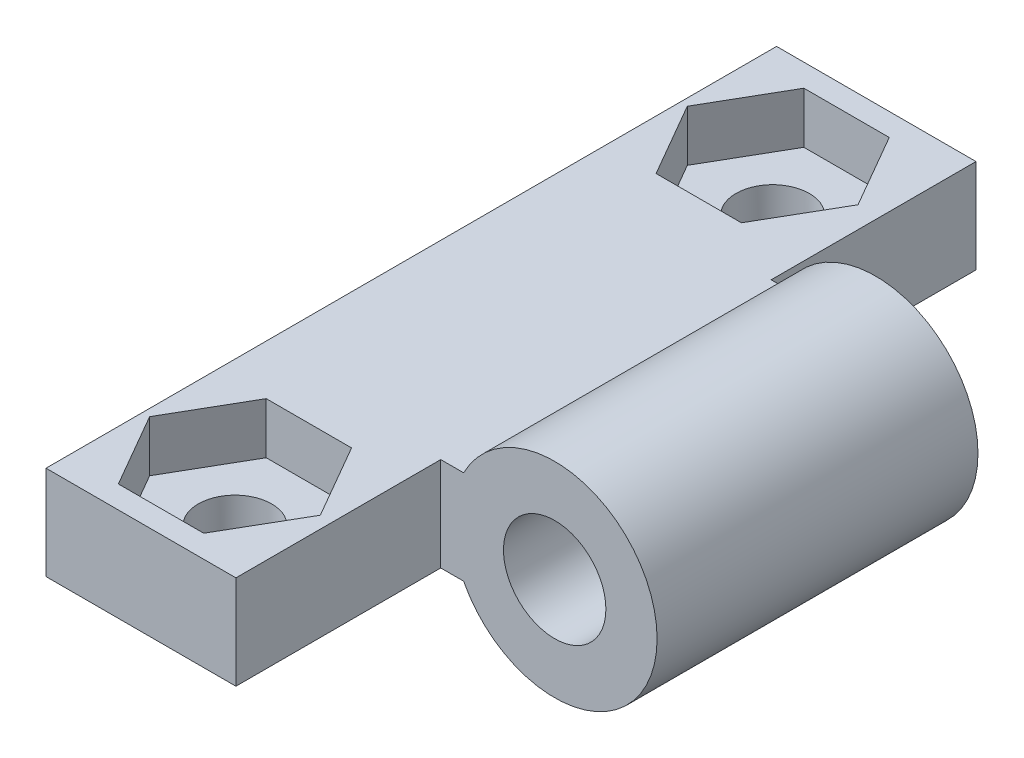
ISO-10303-21;
HEADER;
FILE_DESCRIPTION(('STEP AP214'),'2;1');
FILE_NAME('part.step','',(''),(''),'','','');
FILE_SCHEMA(('AUTOMOTIVE_DESIGN { 1 0 10303 214 1 1 1 1 }'));
ENDSEC;
DATA;
#1=APPLICATION_CONTEXT('core data for automotive mechanical design processes');
#2=APPLICATION_PROTOCOL_DEFINITION('international standard','automotive_design',2000,#1);
#3=PRODUCT_CONTEXT('',#1,'mechanical');
#4=PRODUCT('Part','Part','',(#3));
#5=PRODUCT_RELATED_PRODUCT_CATEGORY('part','',(#4));
#6=PRODUCT_DEFINITION_FORMATION('','',#4);
#7=PRODUCT_DEFINITION_CONTEXT('part definition',#1,'design');
#8=PRODUCT_DEFINITION('design','',#6,#7);
#9=PRODUCT_DEFINITION_SHAPE('','',#8);
#10=(LENGTH_UNIT() NAMED_UNIT(*) SI_UNIT(.MILLI.,.METRE.));
#11=(NAMED_UNIT(*) PLANE_ANGLE_UNIT() SI_UNIT($,.RADIAN.));
#12=(NAMED_UNIT(*) SI_UNIT($,.STERADIAN.) SOLID_ANGLE_UNIT());
#13=UNCERTAINTY_MEASURE_WITH_UNIT(LENGTH_MEASURE(1.E-05),#10,'distance_accuracy_value','');
#14=(GEOMETRIC_REPRESENTATION_CONTEXT(3) GLOBAL_UNCERTAINTY_ASSIGNED_CONTEXT((#13)) GLOBAL_UNIT_ASSIGNED_CONTEXT((#10,
#11,#12)) REPRESENTATION_CONTEXT('',''));
#15=CARTESIAN_POINT('',(0.,0.,0.));
#16=DIRECTION('',(0.,0.,1.));
#17=DIRECTION('',(1.,0.,0.));
#18=AXIS2_PLACEMENT_3D('',#15,#16,#17);
#19=CARTESIAN_POINT('',(0.,5.5,0.));
#20=DIRECTION('',(1.,0.,0.));
#21=DIRECTION('',(0.,0.,-1.));
#22=AXIS2_PLACEMENT_3D('',#19,#20,#21);
#23=PLANE('',#22);
#24=DIRECTION('',(0.,0.,1.));
#25=VECTOR('',#24,1.);
#26=CARTESIAN_POINT('',(0.,0.,0.));
#27=LINE('',#26,#25);
#28=CARTESIAN_POINT('',(0.,0.,0.));
#29=VERTEX_POINT('',#28);
#30=CARTESIAN_POINT('',(0.,0.,42.8));
#31=VERTEX_POINT('',#30);
#32=EDGE_CURVE('E374',#29,#31,#27,.T.);
#33=ORIENTED_EDGE('',*,*,#32,.T.);
#34=DIRECTION('',(0.,-1.,0.));
#35=VECTOR('',#34,1.);
#36=CARTESIAN_POINT('',(0.,5.5,42.8));
#37=LINE('',#36,#35);
#38=CARTESIAN_POINT('',(0.,5.5,42.8));
#39=VERTEX_POINT('',#38);
#40=EDGE_CURVE('E388',#39,#31,#37,.T.);
#41=ORIENTED_EDGE('',*,*,#40,.F.);
#42=DIRECTION('',(0.,0.,1.));
#43=VECTOR('',#42,1.);
#44=CARTESIAN_POINT('',(0.,5.5,0.));
#45=LINE('',#44,#43);
#46=CARTESIAN_POINT('',(0.,5.5,0.));
#47=VERTEX_POINT('',#46);
#48=EDGE_CURVE('E361',#47,#39,#45,.T.);
#49=ORIENTED_EDGE('',*,*,#48,.F.);
#50=DIRECTION('',(0.,-1.,0.));
#51=VECTOR('',#50,1.);
#52=CARTESIAN_POINT('',(0.,5.5,0.));
#53=LINE('',#52,#51);
#54=EDGE_CURVE('E373',#47,#29,#53,.T.);
#55=ORIENTED_EDGE('',*,*,#54,.T.);
#56=EDGE_LOOP('',(#33,#41,#49,#55));
#57=FACE_BOUND('',#56,.T.);
#58=ADVANCED_FACE('F38',(#57),#23,.F.);
#59=CARTESIAN_POINT('',(0.,5.5,42.8));
#60=DIRECTION('',(0.,0.,-1.));
#61=DIRECTION('',(-1.,0.,0.));
#62=AXIS2_PLACEMENT_3D('',#59,#60,#61);
#63=PLANE('',#62);
#64=DIRECTION('',(1.,0.,0.));
#65=VECTOR('',#64,1.);
#66=CARTESIAN_POINT('',(0.,0.,42.8));
#67=LINE('',#66,#65);
#68=CARTESIAN_POINT('',(11.1256258676462,0.,42.8));
#69=VERTEX_POINT('',#68);
#70=EDGE_CURVE('E378',#31,#69,#67,.T.);
#71=ORIENTED_EDGE('',*,*,#70,.T.);
#72=DIRECTION('',(0.,-1.,0.));
#73=VECTOR('',#72,1.);
#74=CARTESIAN_POINT('',(11.1256258676462,9.85688031732629,42.8));
#75=LINE('',#74,#73);
#76=CARTESIAN_POINT('',(11.1256258676462,5.5,42.8));
#77=VERTEX_POINT('',#76);
#78=EDGE_CURVE('E186',#77,#69,#75,.T.);
#79=ORIENTED_EDGE('',*,*,#78,.F.);
#80=DIRECTION('',(1.,0.,0.));
#81=VECTOR('',#80,1.);
#82=CARTESIAN_POINT('',(0.,5.5,42.8));
#83=LINE('',#82,#81);
#84=EDGE_CURVE('E365',#39,#77,#83,.T.);
#85=ORIENTED_EDGE('',*,*,#84,.F.);
#86=ORIENTED_EDGE('',*,*,#40,.T.);
#87=EDGE_LOOP('',(#71,#79,#85,#86));
#88=FACE_BOUND('',#87,.T.);
#89=ADVANCED_FACE('F419',(#88),#63,.F.);
#90=CARTESIAN_POINT('',(0.,5.5,0.));
#91=DIRECTION('',(0.,0.,1.));
#92=DIRECTION('',(1.,0.,0.));
#93=AXIS2_PLACEMENT_3D('',#90,#91,#92);
#94=PLANE('',#93);
#95=DIRECTION('',(-1.,0.,0.));
#96=VECTOR('',#95,1.);
#97=CARTESIAN_POINT('',(0.,5.5,0.));
#98=LINE('',#97,#96);
#99=CARTESIAN_POINT('',(11.6830282454759,5.5,0.));
#100=VERTEX_POINT('',#99);
#101=EDGE_CURVE('E370',#100,#47,#98,.T.);
#102=ORIENTED_EDGE('',*,*,#101,.F.);
#103=DIRECTION('',(0.,1.,0.));
#104=VECTOR('',#103,1.);
#105=CARTESIAN_POINT('',(11.6830282454759,11.3517321487782,0.));
#106=LINE('',#105,#104);
#107=CARTESIAN_POINT('',(11.6830282454759,0.,0.));
#108=VERTEX_POINT('',#107);
#109=EDGE_CURVE('E181',#108,#100,#106,.T.);
#110=ORIENTED_EDGE('',*,*,#109,.F.);
#111=DIRECTION('',(-1.,0.,0.));
#112=VECTOR('',#111,1.);
#113=CARTESIAN_POINT('',(0.,0.,0.));
#114=LINE('',#113,#112);
#115=EDGE_CURVE('E366',#108,#29,#114,.T.);
#116=ORIENTED_EDGE('',*,*,#115,.T.);
#117=ORIENTED_EDGE('',*,*,#54,.F.);
#118=EDGE_LOOP('',(#102,#110,#116,#117));
#119=FACE_BOUND('',#118,.T.);
#120=ADVANCED_FACE('F425',(#119),#94,.F.);
#121=CARTESIAN_POINT('',(0.,5.5,0.));
#122=DIRECTION('',(0.,1.,0.));
#123=DIRECTION('',(0.,0.,1.));
#124=AXIS2_PLACEMENT_3D('',#121,#122,#123);
#125=PLANE('',#124);
#126=DIRECTION('',(0.,0.,1.));
#127=VECTOR('',#126,1.);
#128=CARTESIAN_POINT('',(11.6830282454759,5.5,0.));
#129=LINE('',#128,#127);
#130=CARTESIAN_POINT('',(11.6830282454759,5.5,12.));
#131=VERTEX_POINT('',#130);
#132=EDGE_CURVE('E176',#100,#131,#129,.T.);
#133=ORIENTED_EDGE('',*,*,#132,.F.);
#134=ORIENTED_EDGE('',*,*,#101,.T.);
#135=ORIENTED_EDGE('',*,*,#48,.T.);
#136=ORIENTED_EDGE('',*,*,#84,.T.);
#137=DIRECTION('',(0.,0.,1.));
#138=VECTOR('',#137,1.);
#139=CARTESIAN_POINT('',(11.1256258676462,5.5,0.));
#140=LINE('',#139,#138);
#141=CARTESIAN_POINT('',(11.1256258676462,5.5,30.8));
#142=VERTEX_POINT('',#141);
#143=EDGE_CURVE('E217',#142,#77,#140,.T.);
#144=ORIENTED_EDGE('',*,*,#143,.F.);
#145=DIRECTION('',(1.,0.,0.));
#146=VECTOR('',#145,1.);
#147=CARTESIAN_POINT('',(0.,5.5,30.8));
#148=LINE('',#147,#146);
#149=CARTESIAN_POINT('',(12.4673177480746,5.5,30.8));
#150=VERTEX_POINT('',#149);
#151=EDGE_CURVE('E214',#142,#150,#148,.T.);
#152=ORIENTED_EDGE('',*,*,#151,.T.);
#153=DIRECTION('',(0.,0.,1.));
#154=VECTOR('',#153,1.);
#155=CARTESIAN_POINT('',(12.4673177480746,5.5,-4.97056274847715));
#156=LINE('',#155,#154);
#157=CARTESIAN_POINT('',(12.4673177480746,5.5,12.));
#158=VERTEX_POINT('',#157);
#159=EDGE_CURVE('E201',#158,#150,#156,.T.);
#160=ORIENTED_EDGE('',*,*,#159,.F.);
#161=DIRECTION('',(-1.,0.,0.));
#162=VECTOR('',#161,1.);
#163=CARTESIAN_POINT('',(0.,5.5,12.));
#164=LINE('',#163,#162);
#165=EDGE_CURVE('E187',#158,#131,#164,.T.);
#166=ORIENTED_EDGE('',*,*,#165,.T.);
#167=EDGE_LOOP('',(#133,#134,#135,#136,#144,#152,#160,#166));
#168=FACE_BOUND('',#167,.T.);
#169=DIRECTION('',(-0.5,0.,0.866025403784439));
#170=VECTOR('',#169,1.);
#171=CARTESIAN_POINT('',(0.420411498092338,5.5,5.65));
#172=LINE('',#171,#170);
#173=CARTESIAN_POINT('',(2.92041149809234,5.5,1.31987298107781));
#174=VERTEX_POINT('',#173);
#175=CARTESIAN_POINT('',(0.420411498092339,5.5,5.65));
#176=VERTEX_POINT('',#175);
#177=EDGE_CURVE('E61',#174,#176,#172,.T.);
#178=ORIENTED_EDGE('',*,*,#177,.F.);
#179=DIRECTION('',(-1.,0.,0.));
#180=VECTOR('',#179,1.);
#181=CARTESIAN_POINT('',(2.92041149809234,5.5,1.31987298107781));
#182=LINE('',#181,#180);
#183=CARTESIAN_POINT('',(7.92041149809234,5.5,1.31987298107781));
#184=VERTEX_POINT('',#183);
#185=EDGE_CURVE('E236',#184,#174,#182,.T.);
#186=ORIENTED_EDGE('',*,*,#185,.F.);
#187=DIRECTION('',(-0.5,0.,-0.866025403784439));
#188=VECTOR('',#187,1.);
#189=CARTESIAN_POINT('',(7.92041149809234,5.5,1.31987298107781));
#190=LINE('',#189,#188);
#191=CARTESIAN_POINT('',(10.4204114980923,5.5,5.65));
#192=VERTEX_POINT('',#191);
#193=EDGE_CURVE('E272',#192,#184,#190,.T.);
#194=ORIENTED_EDGE('',*,*,#193,.F.);
#195=DIRECTION('',(0.5,0.,-0.866025403784438));
#196=VECTOR('',#195,1.);
#197=CARTESIAN_POINT('',(10.4204114980923,5.5,5.65));
#198=LINE('',#197,#196);
#199=CARTESIAN_POINT('',(7.92041149809234,5.5,9.98012701892219));
#200=VERTEX_POINT('',#199);
#201=EDGE_CURVE('E268',#200,#192,#198,.T.);
#202=ORIENTED_EDGE('',*,*,#201,.F.);
#203=DIRECTION('',(1.,0.,0.));
#204=VECTOR('',#203,1.);
#205=CARTESIAN_POINT('',(7.92041149809234,5.5,9.98012701892219));
#206=LINE('',#205,#204);
#207=CARTESIAN_POINT('',(2.92041149809234,5.5,9.98012701892219));
#208=VERTEX_POINT('',#207);
#209=EDGE_CURVE('E264',#208,#200,#206,.T.);
#210=ORIENTED_EDGE('',*,*,#209,.F.);
#211=DIRECTION('',(0.5,0.,0.866025403784438));
#212=VECTOR('',#211,1.);
#213=CARTESIAN_POINT('',(2.92041149809234,5.5,9.98012701892219));
#214=LINE('',#213,#212);
#215=EDGE_CURVE('E259',#176,#208,#214,.T.);
#216=ORIENTED_EDGE('',*,*,#215,.F.);
#217=EDGE_LOOP('',(#178,#186,#194,#202,#210,#216));
#218=FACE_BOUND('',#217,.T.);
#219=DIRECTION('',(-1.,0.,0.));
#220=VECTOR('',#219,1.);
#221=CARTESIAN_POINT('',(2.92041149809234,5.5,32.8198729810778));
#222=LINE('',#221,#220);
#223=CARTESIAN_POINT('',(7.92041149809234,5.5,32.8198729810778));
#224=VERTEX_POINT('',#223);
#225=CARTESIAN_POINT('',(2.92041149809234,5.5,32.8198729810778));
#226=VERTEX_POINT('',#225);
#227=EDGE_CURVE('E230',#224,#226,#222,.T.);
#228=ORIENTED_EDGE('',*,*,#227,.F.);
#229=DIRECTION('',(-0.5,0.,-0.866025403784438));
#230=VECTOR('',#229,1.);
#231=CARTESIAN_POINT('',(7.92041149809234,5.5,32.8198729810778));
#232=LINE('',#231,#230);
#233=CARTESIAN_POINT('',(10.4204114980923,5.5,37.15));
#234=VERTEX_POINT('',#233);
#235=EDGE_CURVE('E302',#234,#224,#232,.T.);
#236=ORIENTED_EDGE('',*,*,#235,.F.);
#237=DIRECTION('',(0.5,0.,-0.866025403784439));
#238=VECTOR('',#237,1.);
#239=CARTESIAN_POINT('',(10.4204114980923,5.5,37.15));
#240=LINE('',#239,#238);
#241=CARTESIAN_POINT('',(7.92041149809234,5.5,41.4801270189222));
#242=VERTEX_POINT('',#241);
#243=EDGE_CURVE('E337',#242,#234,#240,.T.);
#244=ORIENTED_EDGE('',*,*,#243,.F.);
#245=DIRECTION('',(1.,0.,0.));
#246=VECTOR('',#245,1.);
#247=CARTESIAN_POINT('',(7.92041149809234,5.5,41.4801270189222));
#248=LINE('',#247,#246);
#249=CARTESIAN_POINT('',(2.92041149809234,5.5,41.4801270189222));
#250=VERTEX_POINT('',#249);
#251=EDGE_CURVE('E333',#250,#242,#248,.T.);
#252=ORIENTED_EDGE('',*,*,#251,.F.);
#253=DIRECTION('',(0.5,0.,0.866025403784439));
#254=VECTOR('',#253,1.);
#255=CARTESIAN_POINT('',(2.92041149809234,5.5,41.4801270189222));
#256=LINE('',#255,#254);
#257=CARTESIAN_POINT('',(0.420411498092338,5.5,37.15));
#258=VERTEX_POINT('',#257);
#259=EDGE_CURVE('E329',#258,#250,#256,.T.);
#260=ORIENTED_EDGE('',*,*,#259,.F.);
#261=DIRECTION('',(-0.500000000000001,0.,0.866025403784438));
#262=VECTOR('',#261,1.);
#263=CARTESIAN_POINT('',(0.420411498092338,5.5,37.15));
#264=LINE('',#263,#262);
#265=EDGE_CURVE('E325',#226,#258,#264,.T.);
#266=ORIENTED_EDGE('',*,*,#265,.F.);
#267=EDGE_LOOP('',(#228,#236,#244,#252,#260,#266));
#268=FACE_BOUND('',#267,.T.);
#269=ADVANCED_FACE('F197',(#168,#218,#268),#125,.T.);
#270=CARTESIAN_POINT('',(0.,0.,0.));
#271=DIRECTION('',(0.,1.,0.));
#272=DIRECTION('',(0.,0.,1.));
#273=AXIS2_PLACEMENT_3D('',#270,#271,#272);
#274=PLANE('',#273);
#275=ORIENTED_EDGE('',*,*,#115,.F.);
#276=DIRECTION('',(0.,0.,1.));
#277=VECTOR('',#276,1.);
#278=CARTESIAN_POINT('',(11.6830282454759,0.,0.));
#279=LINE('',#278,#277);
#280=CARTESIAN_POINT('',(11.6830282454759,0.,12.));
#281=VERTEX_POINT('',#280);
#282=EDGE_CURVE('E11',#108,#281,#279,.T.);
#283=ORIENTED_EDGE('',*,*,#282,.T.);
#284=DIRECTION('',(-1.,0.,0.));
#285=VECTOR('',#284,1.);
#286=CARTESIAN_POINT('',(0.,0.,12.));
#287=LINE('',#286,#285);
#288=CARTESIAN_POINT('',(12.4673177480746,0.,12.));
#289=VERTEX_POINT('',#288);
#290=EDGE_CURVE('E194',#289,#281,#287,.T.);
#291=ORIENTED_EDGE('',*,*,#290,.F.);
#292=DIRECTION('',(0.,0.,1.));
#293=VECTOR('',#292,1.);
#294=CARTESIAN_POINT('',(12.4673177480746,0.,-4.97056274847715));
#295=LINE('',#294,#293);
#296=CARTESIAN_POINT('',(12.4673177480746,0.,30.8));
#297=VERTEX_POINT('',#296);
#298=EDGE_CURVE('E392',#289,#297,#295,.T.);
#299=ORIENTED_EDGE('',*,*,#298,.T.);
#300=DIRECTION('',(1.,0.,0.));
#301=VECTOR('',#300,1.);
#302=CARTESIAN_POINT('',(0.,0.,30.8));
#303=LINE('',#302,#301);
#304=CARTESIAN_POINT('',(11.1256258676462,0.,30.8));
#305=VERTEX_POINT('',#304);
#306=EDGE_CURVE('E53',#305,#297,#303,.T.);
#307=ORIENTED_EDGE('',*,*,#306,.F.);
#308=DIRECTION('',(0.,0.,1.));
#309=VECTOR('',#308,1.);
#310=CARTESIAN_POINT('',(11.1256258676462,0.,0.));
#311=LINE('',#310,#309);
#312=EDGE_CURVE('E46',#305,#69,#311,.T.);
#313=ORIENTED_EDGE('',*,*,#312,.T.);
#314=ORIENTED_EDGE('',*,*,#70,.F.);
#315=ORIENTED_EDGE('',*,*,#32,.F.);
#316=EDGE_LOOP('',(#275,#283,#291,#299,#307,#313,#314,#315));
#317=FACE_BOUND('',#316,.T.);
#318=CARTESIAN_POINT('',(5.42041149809234,0.,5.65));
#319=DIRECTION('',(0.,1.,0.));
#320=DIRECTION('',(0.,0.,1.));
#321=AXIS2_PLACEMENT_3D('',#318,#319,#320);
#322=CIRCLE('',#321,2.15);
#323=CARTESIAN_POINT('',(5.42041149809234,0.,7.8));
#324=VERTEX_POINT('',#323);
#325=EDGE_CURVE('E379',#324,#324,#322,.T.);
#326=ORIENTED_EDGE('',*,*,#325,.T.);
#327=EDGE_LOOP('',(#326));
#328=FACE_BOUND('',#327,.T.);
#329=CARTESIAN_POINT('',(5.42041149809234,0.,37.15));
#330=DIRECTION('',(0.,1.,0.));
#331=DIRECTION('',(0.,0.,1.));
#332=AXIS2_PLACEMENT_3D('',#329,#330,#331);
#333=CIRCLE('',#332,2.15);
#334=CARTESIAN_POINT('',(5.42041149809234,0.,39.3));
#335=VERTEX_POINT('',#334);
#336=EDGE_CURVE('E393',#335,#335,#333,.T.);
#337=ORIENTED_EDGE('',*,*,#336,.T.);
#338=EDGE_LOOP('',(#337));
#339=FACE_BOUND('',#338,.T.);
#340=ADVANCED_FACE('F413',(#317,#328,#339),#274,.F.);
#341=CARTESIAN_POINT('',(5.42041149809234,-4.50000000000003,37.15));
#342=DIRECTION('',(0.,1.,0.));
#343=DIRECTION('',(0.,0.,1.));
#344=AXIS2_PLACEMENT_3D('',#341,#342,#343);
#345=CYLINDRICAL_SURFACE('',#344,2.15);
#346=CARTESIAN_POINT('',(5.42041149809234,2.49999999999997,37.15));
#347=DIRECTION('',(0.,-1.,0.));
#348=DIRECTION('',(0.,0.,-1.));
#349=AXIS2_PLACEMENT_3D('',#346,#347,#348);
#350=CIRCLE('',#349,2.15);
#351=CARTESIAN_POINT('',(5.42041149809234,2.49999999999997,35.));
#352=VERTEX_POINT('',#351);
#353=EDGE_CURVE('E397',#352,#352,#350,.F.);
#354=ORIENTED_EDGE('',*,*,#353,.T.);
#355=EDGE_LOOP('',(#354));
#356=FACE_BOUND('',#355,.T.);
#357=ORIENTED_EDGE('',*,*,#336,.F.);
#358=EDGE_LOOP('',(#357));
#359=FACE_BOUND('',#358,.T.);
#360=ADVANCED_FACE('F468',(#356,#359),#345,.F.);
#361=CARTESIAN_POINT('',(5.42041149809234,-4.50000000000003,5.65));
#362=DIRECTION('',(0.,1.,0.));
#363=DIRECTION('',(0.,0.,1.));
#364=AXIS2_PLACEMENT_3D('',#361,#362,#363);
#365=CYLINDRICAL_SURFACE('',#364,2.15);
#366=CARTESIAN_POINT('',(5.42041149809234,2.49999999999997,5.65));
#367=DIRECTION('',(0.,-1.,0.));
#368=DIRECTION('',(0.,0.,-1.));
#369=AXIS2_PLACEMENT_3D('',#366,#367,#368);
#370=CIRCLE('',#369,2.15);
#371=CARTESIAN_POINT('',(5.42041149809234,2.49999999999997,3.5));
#372=VERTEX_POINT('',#371);
#373=EDGE_CURVE('E282',#372,#372,#370,.F.);
#374=ORIENTED_EDGE('',*,*,#373,.T.);
#375=EDGE_LOOP('',(#374));
#376=FACE_BOUND('',#375,.T.);
#377=ORIENTED_EDGE('',*,*,#325,.F.);
#378=EDGE_LOOP('',(#377));
#379=FACE_BOUND('',#378,.T.);
#380=ADVANCED_FACE('F473',(#376,#379),#365,.F.);
#381=CARTESIAN_POINT('',(0.,2.49999999999997,0.));
#382=DIRECTION('',(0.,-1.,0.));
#383=DIRECTION('',(0.,0.,-1.));
#384=AXIS2_PLACEMENT_3D('',#381,#382,#383);
#385=PLANE('',#384);
#386=DIRECTION('',(-0.5,0.,0.866025403784439));
#387=VECTOR('',#386,1.);
#388=CARTESIAN_POINT('',(0.420411498092338,2.49999999999997,5.65));
#389=LINE('',#388,#387);
#390=CARTESIAN_POINT('',(2.92041149809234,2.49999999999997,1.31987298107781));
#391=VERTEX_POINT('',#390);
#392=CARTESIAN_POINT('',(0.420411498092338,2.49999999999997,5.65));
#393=VERTEX_POINT('',#392);
#394=EDGE_CURVE('E231',#391,#393,#389,.T.);
#395=ORIENTED_EDGE('',*,*,#394,.T.);
#396=DIRECTION('',(0.5,0.,0.866025403784438));
#397=VECTOR('',#396,1.);
#398=CARTESIAN_POINT('',(2.92041149809234,2.49999999999997,9.98012701892219));
#399=LINE('',#398,#397);
#400=CARTESIAN_POINT('',(2.92041149809234,2.49999999999997,9.98012701892219));
#401=VERTEX_POINT('',#400);
#402=EDGE_CURVE('E235',#393,#401,#399,.T.);
#403=ORIENTED_EDGE('',*,*,#402,.T.);
#404=DIRECTION('',(1.,0.,0.));
#405=VECTOR('',#404,1.);
#406=CARTESIAN_POINT('',(7.92041149809234,2.49999999999997,9.98012701892219));
#407=LINE('',#406,#405);
#408=CARTESIAN_POINT('',(7.92041149809234,2.49999999999997,9.98012701892219));
#409=VERTEX_POINT('',#408);
#410=EDGE_CURVE('E240',#401,#409,#407,.T.);
#411=ORIENTED_EDGE('',*,*,#410,.T.);
#412=DIRECTION('',(0.5,0.,-0.866025403784438));
#413=VECTOR('',#412,1.);
#414=CARTESIAN_POINT('',(10.4204114980923,2.49999999999997,5.65));
#415=LINE('',#414,#413);
#416=CARTESIAN_POINT('',(10.4204114980923,2.49999999999997,5.65));
#417=VERTEX_POINT('',#416);
#418=EDGE_CURVE('E244',#409,#417,#415,.T.);
#419=ORIENTED_EDGE('',*,*,#418,.T.);
#420=DIRECTION('',(-0.5,0.,-0.866025403784439));
#421=VECTOR('',#420,1.);
#422=CARTESIAN_POINT('',(7.92041149809234,2.49999999999997,1.31987298107781));
#423=LINE('',#422,#421);
#424=CARTESIAN_POINT('',(7.92041149809234,2.49999999999997,1.31987298107781));
#425=VERTEX_POINT('',#424);
#426=EDGE_CURVE('E248',#417,#425,#423,.T.);
#427=ORIENTED_EDGE('',*,*,#426,.T.);
#428=DIRECTION('',(-1.,0.,0.));
#429=VECTOR('',#428,1.);
#430=CARTESIAN_POINT('',(2.92041149809234,2.49999999999997,1.31987298107781));
#431=LINE('',#430,#429);
#432=EDGE_CURVE('E252',#425,#391,#431,.T.);
#433=ORIENTED_EDGE('',*,*,#432,.T.);
#434=EDGE_LOOP('',(#395,#403,#411,#419,#427,#433));
#435=FACE_BOUND('',#434,.T.);
#436=ORIENTED_EDGE('',*,*,#373,.F.);
#437=EDGE_LOOP('',(#436));
#438=FACE_BOUND('',#437,.T.);
#439=ADVANCED_FACE('F477',(#435,#438),#385,.F.);
#440=CARTESIAN_POINT('',(0.420411498092338,2.49999999999997,5.65));
#441=DIRECTION('',(-0.866025403784439,0.,-0.5));
#442=DIRECTION('',(-0.5,0.,0.866025403784439));
#443=AXIS2_PLACEMENT_3D('',#440,#441,#442);
#444=PLANE('',#443);
#445=ORIENTED_EDGE('',*,*,#177,.T.);
#446=DIRECTION('',(0.,1.,0.));
#447=VECTOR('',#446,1.);
#448=CARTESIAN_POINT('',(0.420411498092338,2.49999999999997,5.65));
#449=LINE('',#448,#447);
#450=EDGE_CURVE('E256',#393,#176,#449,.T.);
#451=ORIENTED_EDGE('',*,*,#450,.F.);
#452=ORIENTED_EDGE('',*,*,#394,.F.);
#453=DIRECTION('',(0.,1.,0.));
#454=VECTOR('',#453,1.);
#455=CARTESIAN_POINT('',(2.92041149809234,2.49999999999997,1.31987298107781));
#456=LINE('',#455,#454);
#457=EDGE_CURVE('E279',#391,#174,#456,.T.);
#458=ORIENTED_EDGE('',*,*,#457,.T.);
#459=EDGE_LOOP('',(#445,#451,#452,#458));
#460=FACE_BOUND('',#459,.T.);
#461=ADVANCED_FACE('F508',(#460),#444,.F.);
#462=CARTESIAN_POINT('',(2.92041149809234,2.49999999999997,1.31987298107781));
#463=DIRECTION('',(0.,0.,-1.));
#464=DIRECTION('',(-1.,0.,0.));
#465=AXIS2_PLACEMENT_3D('',#462,#463,#464);
#466=PLANE('',#465);
#467=ORIENTED_EDGE('',*,*,#185,.T.);
#468=ORIENTED_EDGE('',*,*,#457,.F.);
#469=ORIENTED_EDGE('',*,*,#432,.F.);
#470=DIRECTION('',(0.,1.,0.));
#471=VECTOR('',#470,1.);
#472=CARTESIAN_POINT('',(7.92041149809234,2.49999999999997,1.31987298107781));
#473=LINE('',#472,#471);
#474=EDGE_CURVE('E283',#425,#184,#473,.T.);
#475=ORIENTED_EDGE('',*,*,#474,.T.);
#476=EDGE_LOOP('',(#467,#468,#469,#475));
#477=FACE_BOUND('',#476,.T.);
#478=ADVANCED_FACE('F511',(#477),#466,.F.);
#479=CARTESIAN_POINT('',(7.92041149809234,2.49999999999997,1.31987298107781));
#480=DIRECTION('',(0.866025403784439,0.,-0.5));
#481=DIRECTION('',(-0.5,0.,-0.866025403784439));
#482=AXIS2_PLACEMENT_3D('',#479,#480,#481);
#483=PLANE('',#482);
#484=ORIENTED_EDGE('',*,*,#193,.T.);
#485=ORIENTED_EDGE('',*,*,#474,.F.);
#486=ORIENTED_EDGE('',*,*,#426,.F.);
#487=DIRECTION('',(0.,1.,0.));
#488=VECTOR('',#487,1.);
#489=CARTESIAN_POINT('',(10.4204114980923,2.49999999999997,5.65));
#490=LINE('',#489,#488);
#491=EDGE_CURVE('E286',#417,#192,#490,.T.);
#492=ORIENTED_EDGE('',*,*,#491,.T.);
#493=EDGE_LOOP('',(#484,#485,#486,#492));
#494=FACE_BOUND('',#493,.T.);
#495=ADVANCED_FACE('F522',(#494),#483,.F.);
#496=CARTESIAN_POINT('',(10.4204114980923,2.49999999999997,5.65));
#497=DIRECTION('',(0.866025403784439,0.,0.5));
#498=DIRECTION('',(0.5,0.,-0.866025403784439));
#499=AXIS2_PLACEMENT_3D('',#496,#497,#498);
#500=PLANE('',#499);
#501=ORIENTED_EDGE('',*,*,#201,.T.);
#502=ORIENTED_EDGE('',*,*,#491,.F.);
#503=ORIENTED_EDGE('',*,*,#418,.F.);
#504=DIRECTION('',(0.,1.,0.));
#505=VECTOR('',#504,1.);
#506=CARTESIAN_POINT('',(7.92041149809234,2.49999999999997,9.98012701892219));
#507=LINE('',#506,#505);
#508=EDGE_CURVE('E289',#409,#200,#507,.T.);
#509=ORIENTED_EDGE('',*,*,#508,.T.);
#510=EDGE_LOOP('',(#501,#502,#503,#509));
#511=FACE_BOUND('',#510,.T.);
#512=ADVANCED_FACE('F518',(#511),#500,.F.);
#513=CARTESIAN_POINT('',(7.92041149809234,2.49999999999997,9.98012701892219));
#514=DIRECTION('',(0.,0.,1.));
#515=DIRECTION('',(1.,0.,0.));
#516=AXIS2_PLACEMENT_3D('',#513,#514,#515);
#517=PLANE('',#516);
#518=ORIENTED_EDGE('',*,*,#209,.T.);
#519=ORIENTED_EDGE('',*,*,#508,.F.);
#520=ORIENTED_EDGE('',*,*,#410,.F.);
#521=DIRECTION('',(0.,1.,0.));
#522=VECTOR('',#521,1.);
#523=CARTESIAN_POINT('',(2.92041149809234,2.49999999999997,9.98012701892219));
#524=LINE('',#523,#522);
#525=EDGE_CURVE('E292',#401,#208,#524,.T.);
#526=ORIENTED_EDGE('',*,*,#525,.T.);
#527=EDGE_LOOP('',(#518,#519,#520,#526));
#528=FACE_BOUND('',#527,.T.);
#529=ADVANCED_FACE('F514',(#528),#517,.F.);
#530=CARTESIAN_POINT('',(2.92041149809234,2.49999999999997,9.98012701892219));
#531=DIRECTION('',(-0.866025403784438,0.,0.5));
#532=DIRECTION('',(0.5,0.,0.866025403784438));
#533=AXIS2_PLACEMENT_3D('',#530,#531,#532);
#534=PLANE('',#533);
#535=ORIENTED_EDGE('',*,*,#215,.T.);
#536=ORIENTED_EDGE('',*,*,#525,.F.);
#537=ORIENTED_EDGE('',*,*,#402,.F.);
#538=ORIENTED_EDGE('',*,*,#450,.T.);
#539=EDGE_LOOP('',(#535,#536,#537,#538));
#540=FACE_BOUND('',#539,.T.);
#541=ADVANCED_FACE('F506',(#540),#534,.F.);
#542=CARTESIAN_POINT('',(0.,2.49999999999997,0.));
#543=DIRECTION('',(0.,-1.,0.));
#544=DIRECTION('',(0.,0.,-1.));
#545=AXIS2_PLACEMENT_3D('',#542,#543,#544);
#546=PLANE('',#545);
#547=DIRECTION('',(-1.,0.,0.));
#548=VECTOR('',#547,1.);
#549=CARTESIAN_POINT('',(2.92041149809234,2.49999999999997,32.8198729810778));
#550=LINE('',#549,#548);
#551=CARTESIAN_POINT('',(7.92041149809234,2.49999999999997,32.8198729810778));
#552=VERTEX_POINT('',#551);
#553=CARTESIAN_POINT('',(2.92041149809234,2.49999999999997,32.8198729810778));
#554=VERTEX_POINT('',#553);
#555=EDGE_CURVE('E297',#552,#554,#550,.T.);
#556=ORIENTED_EDGE('',*,*,#555,.T.);
#557=DIRECTION('',(-0.500000000000001,0.,0.866025403784438));
#558=VECTOR('',#557,1.);
#559=CARTESIAN_POINT('',(0.420411498092338,2.49999999999997,37.15));
#560=LINE('',#559,#558);
#561=CARTESIAN_POINT('',(0.420411498092338,2.49999999999997,37.15));
#562=VERTEX_POINT('',#561);
#563=EDGE_CURVE('E301',#554,#562,#560,.T.);
#564=ORIENTED_EDGE('',*,*,#563,.T.);
#565=DIRECTION('',(0.5,0.,0.866025403784439));
#566=VECTOR('',#565,1.);
#567=CARTESIAN_POINT('',(2.92041149809234,2.49999999999997,41.4801270189222));
#568=LINE('',#567,#566);
#569=CARTESIAN_POINT('',(2.92041149809234,2.49999999999997,41.4801270189222));
#570=VERTEX_POINT('',#569);
#571=EDGE_CURVE('E306',#562,#570,#568,.T.);
#572=ORIENTED_EDGE('',*,*,#571,.T.);
#573=DIRECTION('',(1.,0.,0.));
#574=VECTOR('',#573,1.);
#575=CARTESIAN_POINT('',(7.92041149809234,2.49999999999997,41.4801270189222));
#576=LINE('',#575,#574);
#577=CARTESIAN_POINT('',(7.92041149809234,2.49999999999997,41.4801270189222));
#578=VERTEX_POINT('',#577);
#579=EDGE_CURVE('E310',#570,#578,#576,.T.);
#580=ORIENTED_EDGE('',*,*,#579,.T.);
#581=DIRECTION('',(0.5,0.,-0.866025403784439));
#582=VECTOR('',#581,1.);
#583=CARTESIAN_POINT('',(10.4204114980923,2.49999999999997,37.15));
#584=LINE('',#583,#582);
#585=CARTESIAN_POINT('',(10.4204114980923,2.49999999999997,37.15));
#586=VERTEX_POINT('',#585);
#587=EDGE_CURVE('E314',#578,#586,#584,.T.);
#588=ORIENTED_EDGE('',*,*,#587,.T.);
#589=DIRECTION('',(-0.5,0.,-0.866025403784438));
#590=VECTOR('',#589,1.);
#591=CARTESIAN_POINT('',(7.92041149809234,2.49999999999997,32.8198729810778));
#592=LINE('',#591,#590);
#593=EDGE_CURVE('E318',#586,#552,#592,.T.);
#594=ORIENTED_EDGE('',*,*,#593,.T.);
#595=EDGE_LOOP('',(#556,#564,#572,#580,#588,#594));
#596=FACE_BOUND('',#595,.T.);
#597=ORIENTED_EDGE('',*,*,#353,.F.);
#598=EDGE_LOOP('',(#597));
#599=FACE_BOUND('',#598,.T.);
#600=ADVANCED_FACE('F483',(#596,#599),#546,.F.);
#601=CARTESIAN_POINT('',(2.92041149809234,2.49999999999997,32.8198729810778));
#602=DIRECTION('',(0.,0.,-1.));
#603=DIRECTION('',(-1.,0.,0.));
#604=AXIS2_PLACEMENT_3D('',#601,#602,#603);
#605=PLANE('',#604);
#606=ORIENTED_EDGE('',*,*,#227,.T.);
#607=DIRECTION('',(0.,1.,0.));
#608=VECTOR('',#607,1.);
#609=CARTESIAN_POINT('',(2.92041149809234,2.49999999999997,32.8198729810778));
#610=LINE('',#609,#608);
#611=EDGE_CURVE('E322',#554,#226,#610,.T.);
#612=ORIENTED_EDGE('',*,*,#611,.F.);
#613=ORIENTED_EDGE('',*,*,#555,.F.);
#614=DIRECTION('',(0.,1.,0.));
#615=VECTOR('',#614,1.);
#616=CARTESIAN_POINT('',(7.92041149809234,2.49999999999997,32.8198729810778));
#617=LINE('',#616,#615);
#618=EDGE_CURVE('E260',#552,#224,#617,.T.);
#619=ORIENTED_EDGE('',*,*,#618,.T.);
#620=EDGE_LOOP('',(#606,#612,#613,#619));
#621=FACE_BOUND('',#620,.T.);
#622=ADVANCED_FACE('F479',(#621),#605,.F.);
#623=CARTESIAN_POINT('',(7.92041149809234,2.49999999999997,32.8198729810778));
#624=DIRECTION('',(0.866025403784438,0.,-0.5));
#625=DIRECTION('',(-0.5,0.,-0.866025403784439));
#626=AXIS2_PLACEMENT_3D('',#623,#624,#625);
#627=PLANE('',#626);
#628=ORIENTED_EDGE('',*,*,#235,.T.);
#629=ORIENTED_EDGE('',*,*,#618,.F.);
#630=ORIENTED_EDGE('',*,*,#593,.F.);
#631=DIRECTION('',(0.,1.,0.));
#632=VECTOR('',#631,1.);
#633=CARTESIAN_POINT('',(10.4204114980923,2.49999999999997,37.15));
#634=LINE('',#633,#632);
#635=EDGE_CURVE('E346',#586,#234,#634,.T.);
#636=ORIENTED_EDGE('',*,*,#635,.T.);
#637=EDGE_LOOP('',(#628,#629,#630,#636));
#638=FACE_BOUND('',#637,.T.);
#639=ADVANCED_FACE('F482',(#638),#627,.F.);
#640=CARTESIAN_POINT('',(10.4204114980923,2.49999999999997,37.15));
#641=DIRECTION('',(0.866025403784439,0.,0.5));
#642=DIRECTION('',(0.5,0.,-0.866025403784439));
#643=AXIS2_PLACEMENT_3D('',#640,#641,#642);
#644=PLANE('',#643);
#645=ORIENTED_EDGE('',*,*,#243,.T.);
#646=ORIENTED_EDGE('',*,*,#635,.F.);
#647=ORIENTED_EDGE('',*,*,#587,.F.);
#648=DIRECTION('',(0.,1.,0.));
#649=VECTOR('',#648,1.);
#650=CARTESIAN_POINT('',(7.92041149809234,2.49999999999997,41.4801270189222));
#651=LINE('',#650,#649);
#652=EDGE_CURVE('E349',#578,#242,#651,.T.);
#653=ORIENTED_EDGE('',*,*,#652,.T.);
#654=EDGE_LOOP('',(#645,#646,#647,#653));
#655=FACE_BOUND('',#654,.T.);
#656=ADVANCED_FACE('F496',(#655),#644,.F.);
#657=CARTESIAN_POINT('',(7.92041149809234,2.49999999999997,41.4801270189222));
#658=DIRECTION('',(0.,0.,1.));
#659=DIRECTION('',(1.,0.,0.));
#660=AXIS2_PLACEMENT_3D('',#657,#658,#659);
#661=PLANE('',#660);
#662=ORIENTED_EDGE('',*,*,#251,.T.);
#663=ORIENTED_EDGE('',*,*,#652,.F.);
#664=ORIENTED_EDGE('',*,*,#579,.F.);
#665=DIRECTION('',(0.,1.,0.));
#666=VECTOR('',#665,1.);
#667=CARTESIAN_POINT('',(2.92041149809234,2.49999999999997,41.4801270189222));
#668=LINE('',#667,#666);
#669=EDGE_CURVE('E352',#570,#250,#668,.T.);
#670=ORIENTED_EDGE('',*,*,#669,.T.);
#671=EDGE_LOOP('',(#662,#663,#664,#670));
#672=FACE_BOUND('',#671,.T.);
#673=ADVANCED_FACE('F492',(#672),#661,.F.);
#674=CARTESIAN_POINT('',(2.92041149809234,2.49999999999997,41.4801270189222));
#675=DIRECTION('',(-0.866025403784439,0.,0.5));
#676=DIRECTION('',(0.5,0.,0.866025403784439));
#677=AXIS2_PLACEMENT_3D('',#674,#675,#676);
#678=PLANE('',#677);
#679=ORIENTED_EDGE('',*,*,#259,.T.);
#680=ORIENTED_EDGE('',*,*,#669,.F.);
#681=ORIENTED_EDGE('',*,*,#571,.F.);
#682=DIRECTION('',(0.,1.,0.));
#683=VECTOR('',#682,1.);
#684=CARTESIAN_POINT('',(0.420411498092338,2.49999999999997,37.15));
#685=LINE('',#684,#683);
#686=EDGE_CURVE('E355',#562,#258,#685,.T.);
#687=ORIENTED_EDGE('',*,*,#686,.T.);
#688=EDGE_LOOP('',(#679,#680,#681,#687));
#689=FACE_BOUND('',#688,.T.);
#690=ADVANCED_FACE('F488',(#689),#678,.F.);
#691=CARTESIAN_POINT('',(0.420411498092338,2.49999999999997,37.15));
#692=DIRECTION('',(-0.866025403784438,0.,-0.500000000000001));
#693=DIRECTION('',(-0.500000000000001,0.,0.866025403784438));
#694=AXIS2_PLACEMENT_3D('',#691,#692,#693);
#695=PLANE('',#694);
#696=ORIENTED_EDGE('',*,*,#265,.T.);
#697=ORIENTED_EDGE('',*,*,#686,.F.);
#698=ORIENTED_EDGE('',*,*,#563,.F.);
#699=ORIENTED_EDGE('',*,*,#611,.T.);
#700=EDGE_LOOP('',(#696,#697,#698,#699));
#701=FACE_BOUND('',#700,.T.);
#702=ADVANCED_FACE('F485',(#701),#695,.F.);
#703=CARTESIAN_POINT('',(0.,0.,12.));
#704=DIRECTION('',(0.,0.,-1.));
#705=DIRECTION('',(-1.,0.,0.));
#706=AXIS2_PLACEMENT_3D('',#703,#704,#705);
#707=PLANE('',#706);
#708=CARTESIAN_POINT('',(17.8,2.75,12.));
#709=DIRECTION('',(0.,0.,-1.));
#710=DIRECTION('',(-1.,0.,0.));
#711=AXIS2_PLACEMENT_3D('',#708,#709,#710);
#712=CIRCLE('',#711,3.);
#713=CARTESIAN_POINT('',(14.8,2.75,12.));
#714=VERTEX_POINT('',#713);
#715=EDGE_CURVE('E427',#714,#714,#712,.T.);
#716=ORIENTED_EDGE('',*,*,#715,.F.);
#717=EDGE_LOOP('',(#716));
#718=FACE_BOUND('',#717,.T.);
#719=ORIENTED_EDGE('',*,*,#165,.F.);
#720=CARTESIAN_POINT('',(17.8,2.75,12.));
#721=DIRECTION('',(0.,0.,-1.));
#722=DIRECTION('',(-1.,0.,0.));
#723=AXIS2_PLACEMENT_3D('',#720,#721,#722);
#724=CIRCLE('',#723,6.);
#725=EDGE_CURVE('E225',#289,#158,#724,.F.);
#726=ORIENTED_EDGE('',*,*,#725,.F.);
#727=ORIENTED_EDGE('',*,*,#290,.T.);
#728=DIRECTION('',(0.,-1.,0.));
#729=VECTOR('',#728,1.);
#730=CARTESIAN_POINT('',(11.6830282454759,11.3517321487782,12.));
#731=LINE('',#730,#729);
#732=EDGE_CURVE('E179',#131,#281,#731,.T.);
#733=ORIENTED_EDGE('',*,*,#732,.F.);
#734=EDGE_LOOP('',(#719,#726,#727,#733));
#735=FACE_BOUND('',#734,.T.);
#736=ADVANCED_FACE('F191',(#718,#735),#707,.T.);
#737=CARTESIAN_POINT('',(17.8,2.75,30.8));
#738=DIRECTION('',(0.,0.,1.));
#739=DIRECTION('',(1.,0.,0.));
#740=AXIS2_PLACEMENT_3D('',#737,#738,#739);
#741=PLANE('',#740);
#742=CARTESIAN_POINT('',(17.8,2.75,30.8));
#743=DIRECTION('',(0.,0.,1.));
#744=DIRECTION('',(1.,0.,0.));
#745=AXIS2_PLACEMENT_3D('',#742,#743,#744);
#746=CIRCLE('',#745,3.);
#747=CARTESIAN_POINT('',(20.8,2.75,30.8));
#748=VERTEX_POINT('',#747);
#749=EDGE_CURVE('E430',#748,#748,#746,.T.);
#750=ORIENTED_EDGE('',*,*,#749,.F.);
#751=EDGE_LOOP('',(#750));
#752=FACE_BOUND('',#751,.T.);
#753=CARTESIAN_POINT('',(17.8,2.75,30.8));
#754=DIRECTION('',(0.,0.,1.));
#755=DIRECTION('',(1.,0.,0.));
#756=AXIS2_PLACEMENT_3D('',#753,#754,#755);
#757=CIRCLE('',#756,6.);
#758=EDGE_CURVE('E222',#297,#150,#757,.T.);
#759=ORIENTED_EDGE('',*,*,#758,.T.);
#760=ORIENTED_EDGE('',*,*,#151,.F.);
#761=DIRECTION('',(0.,1.,0.));
#762=VECTOR('',#761,1.);
#763=CARTESIAN_POINT('',(11.1256258676462,9.85688031732629,30.8));
#764=LINE('',#763,#762);
#765=EDGE_CURVE('E208',#305,#142,#764,.T.);
#766=ORIENTED_EDGE('',*,*,#765,.F.);
#767=ORIENTED_EDGE('',*,*,#306,.T.);
#768=EDGE_LOOP('',(#759,#760,#766,#767));
#769=FACE_BOUND('',#768,.T.);
#770=ADVANCED_FACE('F439',(#752,#769),#741,.T.);
#771=CARTESIAN_POINT('',(17.8,2.75,-4.97056274847715));
#772=DIRECTION('',(0.,0.,1.));
#773=DIRECTION('',(1.,0.,0.));
#774=AXIS2_PLACEMENT_3D('',#771,#772,#773);
#775=CYLINDRICAL_SURFACE('',#774,6.);
#776=ORIENTED_EDGE('',*,*,#725,.T.);
#777=ORIENTED_EDGE('',*,*,#159,.T.);
#778=ORIENTED_EDGE('',*,*,#758,.F.);
#779=ORIENTED_EDGE('',*,*,#298,.F.);
#780=EDGE_LOOP('',(#776,#777,#778,#779));
#781=FACE_BOUND('',#780,.T.);
#782=ADVANCED_FACE('F441',(#781),#775,.T.);
#783=CARTESIAN_POINT('',(11.1256258676462,9.85688031732629,13.793715515982));
#784=DIRECTION('',(-1.,0.,0.));
#785=DIRECTION('',(0.,0.,1.));
#786=AXIS2_PLACEMENT_3D('',#783,#784,#785);
#787=PLANE('',#786);
#788=ORIENTED_EDGE('',*,*,#143,.T.);
#789=ORIENTED_EDGE('',*,*,#78,.T.);
#790=ORIENTED_EDGE('',*,*,#312,.F.);
#791=ORIENTED_EDGE('',*,*,#765,.T.);
#792=EDGE_LOOP('',(#788,#789,#790,#791));
#793=FACE_BOUND('',#792,.T.);
#794=ADVANCED_FACE('F447',(#793),#787,.F.);
#795=CARTESIAN_POINT('',(11.6830282454759,11.3517321487782,29.7490077052368));
#796=DIRECTION('',(-1.,0.,0.));
#797=DIRECTION('',(0.,-1.,0.));
#798=AXIS2_PLACEMENT_3D('',#795,#796,#797);
#799=PLANE('',#798);
#800=ORIENTED_EDGE('',*,*,#132,.T.);
#801=ORIENTED_EDGE('',*,*,#732,.T.);
#802=ORIENTED_EDGE('',*,*,#282,.F.);
#803=ORIENTED_EDGE('',*,*,#109,.T.);
#804=EDGE_LOOP('',(#800,#801,#802,#803));
#805=FACE_BOUND('',#804,.T.);
#806=ADVANCED_FACE('F178',(#805),#799,.F.);
#807=CARTESIAN_POINT('',(17.8,2.75,8.79999999999999));
#808=DIRECTION('',(0.,0.,1.));
#809=DIRECTION('',(1.,0.,0.));
#810=AXIS2_PLACEMENT_3D('',#807,#808,#809);
#811=CYLINDRICAL_SURFACE('',#810,3.);
#812=ORIENTED_EDGE('',*,*,#715,.T.);
#813=EDGE_LOOP('',(#812));
#814=FACE_BOUND('',#813,.T.);
#815=ORIENTED_EDGE('',*,*,#749,.T.);
#816=EDGE_LOOP('',(#815));
#817=FACE_BOUND('',#816,.T.);
#818=ADVANCED_FACE('F437',(#814,#817),#811,.F.);
#819=CLOSED_SHELL('',(#58,#89,#120,#269,#340,#360,#380,#439,#461,#478,#495,#512,#529,#541,#600,
#622,#639,#656,#673,#690,#702,#736,#770,#782,#794,#806,#818));
#820=MANIFOLD_SOLID_BREP('B2',#819);
#821=ADVANCED_BREP_SHAPE_REPRESENTATION('',(#18,#820),#14);
#822=SHAPE_DEFINITION_REPRESENTATION(#9,#821);
ENDSEC;
END-ISO-10303-21;
